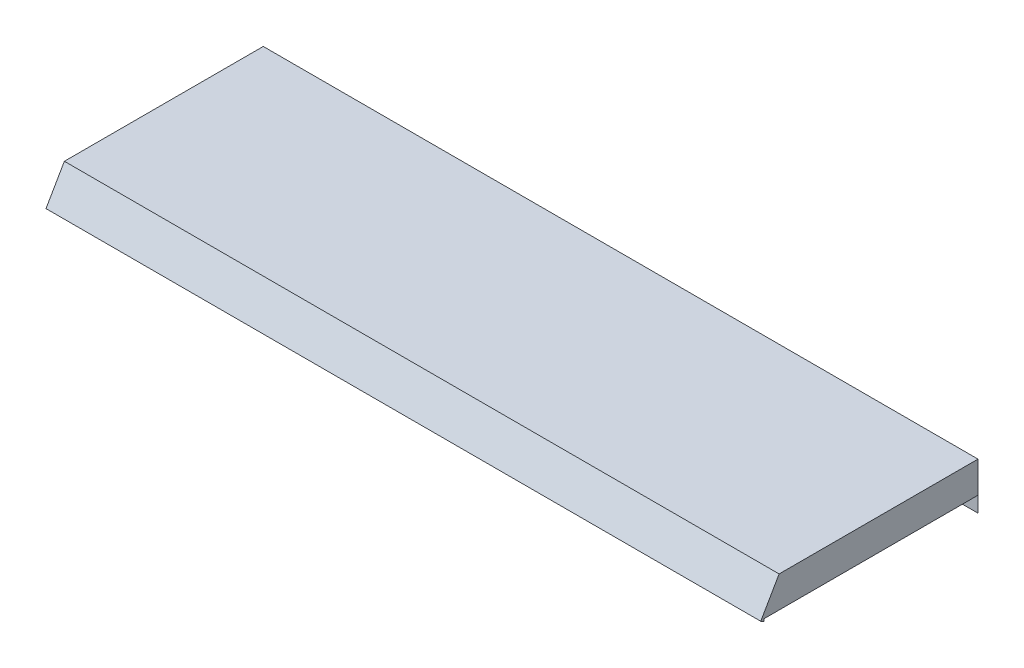
ISO-10303-21;
HEADER;
FILE_DESCRIPTION(('STEP AP214'),'2;1');
FILE_NAME('part.step','',(''),(''),'','','');
FILE_SCHEMA(('AUTOMOTIVE_DESIGN { 1 0 10303 214 1 1 1 1 }'));
ENDSEC;
DATA;
#1=APPLICATION_CONTEXT('core data for automotive mechanical design processes');
#2=APPLICATION_PROTOCOL_DEFINITION('international standard','automotive_design',2000,#1);
#3=PRODUCT_CONTEXT('',#1,'mechanical');
#4=PRODUCT('Part','Part','',(#3));
#5=PRODUCT_RELATED_PRODUCT_CATEGORY('part','',(#4));
#6=PRODUCT_DEFINITION_FORMATION('','',#4);
#7=PRODUCT_DEFINITION_CONTEXT('part definition',#1,'design');
#8=PRODUCT_DEFINITION('design','',#6,#7);
#9=PRODUCT_DEFINITION_SHAPE('','',#8);
#10=(LENGTH_UNIT() NAMED_UNIT(*) SI_UNIT(.MILLI.,.METRE.));
#11=(NAMED_UNIT(*) PLANE_ANGLE_UNIT() SI_UNIT($,.RADIAN.));
#12=(NAMED_UNIT(*) SI_UNIT($,.STERADIAN.) SOLID_ANGLE_UNIT());
#13=UNCERTAINTY_MEASURE_WITH_UNIT(LENGTH_MEASURE(1.E-05),#10,'distance_accuracy_value','');
#14=(GEOMETRIC_REPRESENTATION_CONTEXT(3) GLOBAL_UNCERTAINTY_ASSIGNED_CONTEXT((#13)) GLOBAL_UNIT_ASSIGNED_CONTEXT((#10,
#11,#12)) REPRESENTATION_CONTEXT('',''));
#15=CARTESIAN_POINT('',(0.,0.,0.));
#16=DIRECTION('',(0.,0.,1.));
#17=DIRECTION('',(1.,0.,0.));
#18=AXIS2_PLACEMENT_3D('',#15,#16,#17);
#19=CARTESIAN_POINT('',(191.,0.,0.));
#20=DIRECTION('',(-1.,0.,0.));
#21=DIRECTION('',(0.,0.,1.));
#22=AXIS2_PLACEMENT_3D('',#19,#20,#21);
#23=PLANE('',#22);
#24=DIRECTION('',(0.,0.,1.));
#25=VECTOR('',#24,1.);
#26=CARTESIAN_POINT('',(191.,52.0482754030357,-123.214198806139));
#27=LINE('',#26,#25);
#28=CARTESIAN_POINT('',(191.,52.0482754030357,-114.224498130945));
#29=VERTEX_POINT('',#28);
#30=CARTESIAN_POINT('',(191.,52.0482754030357,-63.0226906539127));
#31=VERTEX_POINT('',#30);
#32=EDGE_CURVE('E108',#29,#31,#27,.T.);
#33=ORIENTED_EDGE('',*,*,#32,.T.);
#34=DIRECTION('',(0.,0.866041614639342,-0.499971920924447));
#35=VECTOR('',#34,1.);
#36=CARTESIAN_POINT('',(191.,-14.2779963984741,-24.7320670166552));
#37=LINE('',#36,#35);
#38=CARTESIAN_POINT('',(191.,43.8581981490481,-58.294501398364));
#39=VERTEX_POINT('',#38);
#40=EDGE_CURVE('E40',#39,#31,#37,.T.);
#41=ORIENTED_EDGE('',*,*,#40,.F.);
#42=DIRECTION('',(0.,-0.499971920924447,-0.866041614639342));
#43=VECTOR('',#42,1.);
#44=CARTESIAN_POINT('',(191.,41.8583104653503,-61.7586678569213));
#45=LINE('',#44,#43);
#46=CARTESIAN_POINT('',(191.,43.3602818059935,-59.1569823810899));
#47=VERTEX_POINT('',#46);
#48=EDGE_CURVE('E116',#39,#47,#45,.T.);
#49=ORIENTED_EDGE('',*,*,#48,.T.);
#50=DIRECTION('',(0.,-0.999999999759779,2.19189973345429E-05));
#51=VECTOR('',#50,1.);
#52=CARTESIAN_POINT('',(191.,43.9996794736459,-59.1569963960457));
#53=LINE('',#52,#51);
#54=CARTESIAN_POINT('',(191.,43.9996794736459,-59.1569963960457));
#55=VERTEX_POINT('',#54);
#56=EDGE_CURVE('E53',#55,#47,#53,.T.);
#57=ORIENTED_EDGE('',*,*,#56,.F.);
#58=DIRECTION('',(0.,2.19189973345185E-05,0.999999999759779));
#59=VECTOR('',#58,1.);
#60=CARTESIAN_POINT('',(191.,43.9984726788402,-114.214022360373));
#61=LINE('',#60,#59);
#62=CARTESIAN_POINT('',(191.,43.9984726788402,-114.214022360373));
#63=VERTEX_POINT('',#62);
#64=EDGE_CURVE('E89',#63,#55,#61,.T.);
#65=ORIENTED_EDGE('',*,*,#64,.F.);
#66=DIRECTION('',(0.,-0.999999999759779,2.19189973345429E-05));
#67=VECTOR('',#66,1.);
#68=CARTESIAN_POINT('',(191.,43.9984726788402,-114.214022360373));
#69=LINE('',#68,#67);
#70=CARTESIAN_POINT('',(191.,39.9984726798011,-114.213934684384));
#71=VERTEX_POINT('',#70);
#72=EDGE_CURVE('E77',#63,#71,#69,.T.);
#73=ORIENTED_EDGE('',*,*,#72,.T.);
#74=DIRECTION('',(0.,2.19189973345429E-05,0.999999999759779));
#75=VECTOR('',#74,1.);
#76=CARTESIAN_POINT('',(191.,40.0009761155134,-0.000876781289065675));
#77=LINE('',#76,#75);
#78=CARTESIAN_POINT('',(191.,39.9984726740802,-114.214195685279));
#79=VERTEX_POINT('',#78);
#80=EDGE_CURVE('E161',#79,#71,#77,.T.);
#81=ORIENTED_EDGE('',*,*,#80,.F.);
#82=DIRECTION('',(0.,-0.999999634497327,0.000854988428673071));
#83=VECTOR('',#82,1.);
#84=CARTESIAN_POINT('',(191.,-0.097622540917072,-114.179913975305));
#85=LINE('',#84,#83);
#86=EDGE_CURVE('E122',#29,#79,#85,.T.);
#87=ORIENTED_EDGE('',*,*,#86,.F.);
#88=EDGE_LOOP('',(#33,#41,#49,#57,#65,#73,#81,#87));
#89=FACE_BOUND('',#88,.T.);
#90=ADVANCED_FACE('F36',(#89),#23,.F.);
#91=CARTESIAN_POINT('',(0.,-0.097622540917072,-114.179913975305));
#92=DIRECTION('',(0.,0.000854988428673071,0.999999634497327));
#93=DIRECTION('',(0.,-0.999999634497327,0.000854988428673071));
#94=AXIS2_PLACEMENT_3D('',#91,#92,#93);
#95=PLANE('',#94);
#96=DIRECTION('',(0.,0.999999634497327,-0.000854988428673071));
#97=VECTOR('',#96,1.);
#98=CARTESIAN_POINT('',(7.,-0.097622540917072,-114.179913975305));
#99=LINE('',#98,#97);
#100=CARTESIAN_POINT('',(7.,39.9984726740519,-114.214196978625));
#101=VERTEX_POINT('',#100);
#102=CARTESIAN_POINT('',(7.,52.0482754030357,-114.224498130945));
#103=VERTEX_POINT('',#102);
#104=EDGE_CURVE('E125',#101,#103,#99,.T.);
#105=ORIENTED_EDGE('',*,*,#104,.T.);
#106=DIRECTION('',(1.,0.,0.));
#107=VECTOR('',#106,1.);
#108=CARTESIAN_POINT('',(0.,52.0482754030357,-114.224498130945));
#109=LINE('',#108,#107);
#110=EDGE_CURVE('E110',#103,#29,#109,.T.);
#111=ORIENTED_EDGE('',*,*,#110,.T.);
#112=ORIENTED_EDGE('',*,*,#86,.T.);
#113=DIRECTION('',(1.,0.,0.));
#114=VECTOR('',#113,1.);
#115=CARTESIAN_POINT('',(0.,39.9984726740802,-114.214195685279));
#116=LINE('',#115,#114);
#117=EDGE_CURVE('E165',#101,#79,#116,.T.);
#118=ORIENTED_EDGE('',*,*,#117,.F.);
#119=EDGE_LOOP('',(#105,#111,#112,#118));
#120=FACE_BOUND('',#119,.T.);
#121=ADVANCED_FACE('F38',(#120),#95,.F.);
#122=CARTESIAN_POINT('',(0.,-14.2779963984741,-24.7320670166552));
#123=DIRECTION('',(0.,-0.499971920924447,-0.866041614639342));
#124=DIRECTION('',(0.,0.866041614639342,-0.499971920924447));
#125=AXIS2_PLACEMENT_3D('',#122,#123,#124);
#126=PLANE('',#125);
#127=DIRECTION('',(-1.,0.,0.));
#128=VECTOR('',#127,1.);
#129=CARTESIAN_POINT('',(0.,52.0482754030357,-63.0226906539127));
#130=LINE('',#129,#128);
#131=CARTESIAN_POINT('',(7.,52.0482754030357,-63.0226906539127));
#132=VERTEX_POINT('',#131);
#133=EDGE_CURVE('E105',#31,#132,#130,.T.);
#134=ORIENTED_EDGE('',*,*,#133,.T.);
#135=DIRECTION('',(0.,0.866041614639342,-0.499971920924447));
#136=VECTOR('',#135,1.);
#137=CARTESIAN_POINT('',(7.,-14.2779963984741,-24.7320670166552));
#138=LINE('',#137,#136);
#139=CARTESIAN_POINT('',(7.00000000000001,43.8581981490481,-58.294501398364));
#140=VERTEX_POINT('',#139);
#141=EDGE_CURVE('E127',#140,#132,#138,.T.);
#142=ORIENTED_EDGE('',*,*,#141,.F.);
#143=DIRECTION('',(1.,0.,0.));
#144=VECTOR('',#143,1.);
#145=CARTESIAN_POINT('',(195.104983797478,43.8581981490481,-58.294501398364));
#146=LINE('',#145,#144);
#147=EDGE_CURVE('E87',#140,#39,#146,.T.);
#148=ORIENTED_EDGE('',*,*,#147,.T.);
#149=ORIENTED_EDGE('',*,*,#40,.T.);
#150=EDGE_LOOP('',(#134,#142,#148,#149));
#151=FACE_BOUND('',#150,.T.);
#152=ADVANCED_FACE('F138',(#151),#126,.F.);
#153=CARTESIAN_POINT('',(7.,0.,0.));
#154=DIRECTION('',(1.,0.,0.));
#155=DIRECTION('',(0.,0.,-1.));
#156=AXIS2_PLACEMENT_3D('',#153,#154,#155);
#157=PLANE('',#156);
#158=DIRECTION('',(0.,0.,-1.));
#159=VECTOR('',#158,1.);
#160=CARTESIAN_POINT('',(7.,52.0482754030357,-123.214198806139));
#161=LINE('',#160,#159);
#162=EDGE_CURVE('E101',#132,#103,#161,.T.);
#163=ORIENTED_EDGE('',*,*,#162,.T.);
#164=ORIENTED_EDGE('',*,*,#104,.F.);
#165=DIRECTION('',(0.,-2.19189973345429E-05,-0.999999999759779));
#166=VECTOR('',#165,1.);
#167=CARTESIAN_POINT('',(7.,40.0009761155134,-0.000876781289065675));
#168=LINE('',#167,#166);
#169=CARTESIAN_POINT('',(7.,39.9984726798011,-114.213934684384));
#170=VERTEX_POINT('',#169);
#171=EDGE_CURVE('E168',#170,#101,#168,.T.);
#172=ORIENTED_EDGE('',*,*,#171,.F.);
#173=DIRECTION('',(0.,-0.999999999759779,2.19189973345429E-05));
#174=VECTOR('',#173,1.);
#175=CARTESIAN_POINT('',(7.,43.9984726788402,-114.214022360373));
#176=LINE('',#175,#174);
#177=CARTESIAN_POINT('',(7.,43.9984726788402,-114.214022360373));
#178=VERTEX_POINT('',#177);
#179=EDGE_CURVE('E61',#178,#170,#176,.T.);
#180=ORIENTED_EDGE('',*,*,#179,.F.);
#181=DIRECTION('',(0.,-2.19189973345185E-05,-0.999999999759779));
#182=VECTOR('',#181,1.);
#183=CARTESIAN_POINT('',(7.,43.9984726788402,-114.214022360373));
#184=LINE('',#183,#182);
#185=CARTESIAN_POINT('',(7.,43.9996794736459,-59.1569963960457));
#186=VERTEX_POINT('',#185);
#187=EDGE_CURVE('E45',#186,#178,#184,.T.);
#188=ORIENTED_EDGE('',*,*,#187,.F.);
#189=DIRECTION('',(0.,-0.999999999759779,2.19189973345429E-05));
#190=VECTOR('',#189,1.);
#191=CARTESIAN_POINT('',(7.,43.9996794736459,-59.1569963960457));
#192=LINE('',#191,#190);
#193=CARTESIAN_POINT('',(7.,43.3602818059935,-59.1569823810899));
#194=VERTEX_POINT('',#193);
#195=EDGE_CURVE('E86',#186,#194,#192,.T.);
#196=ORIENTED_EDGE('',*,*,#195,.T.);
#197=DIRECTION('',(0.,0.499971920924447,0.866041614639342));
#198=VECTOR('',#197,1.);
#199=CARTESIAN_POINT('',(7.00000000000001,41.8583104653503,-61.7586678569213));
#200=LINE('',#199,#198);
#201=EDGE_CURVE('E113',#194,#140,#200,.T.);
#202=ORIENTED_EDGE('',*,*,#201,.T.);
#203=ORIENTED_EDGE('',*,*,#141,.T.);
#204=EDGE_LOOP('',(#163,#164,#172,#180,#188,#196,#202,#203));
#205=FACE_BOUND('',#204,.T.);
#206=ADVANCED_FACE('F152',(#205),#157,.F.);
#207=CARTESIAN_POINT('',(0.,39.9982754030357,-123.214198806139));
#208=DIRECTION('',(0.,-0.999999999759779,2.19189973345429E-05));
#209=DIRECTION('',(0.,-2.19189973345429E-05,-0.999999999759779));
#210=AXIS2_PLACEMENT_3D('',#207,#208,#209);
#211=PLANE('',#210);
#212=DIRECTION('',(1.,0.,0.));
#213=VECTOR('',#212,1.);
#214=CARTESIAN_POINT('',(7.,39.9984726798011,-114.213934684384));
#215=LINE('',#214,#213);
#216=EDGE_CURVE('E11',#170,#71,#215,.T.);
#217=ORIENTED_EDGE('',*,*,#216,.F.);
#218=ORIENTED_EDGE('',*,*,#171,.T.);
#219=ORIENTED_EDGE('',*,*,#117,.T.);
#220=ORIENTED_EDGE('',*,*,#80,.T.);
#221=EDGE_LOOP('',(#217,#218,#219,#220));
#222=FACE_BOUND('',#221,.T.);
#223=ADVANCED_FACE('F170',(#222),#211,.T.);
#224=CARTESIAN_POINT('',(7.,43.9996794736459,-59.1569963960457));
#225=DIRECTION('',(0.,2.19189973345429E-05,0.999999999759779));
#226=DIRECTION('',(0.,-0.999999999759779,2.19189973345429E-05));
#227=AXIS2_PLACEMENT_3D('',#224,#225,#226);
#228=PLANE('',#227);
#229=DIRECTION('',(1.,0.,0.));
#230=VECTOR('',#229,1.);
#231=CARTESIAN_POINT('',(7.,43.3602818059935,-59.1569823810899));
#232=LINE('',#231,#230);
#233=EDGE_CURVE('E104',#194,#47,#232,.T.);
#234=ORIENTED_EDGE('',*,*,#233,.F.);
#235=ORIENTED_EDGE('',*,*,#195,.F.);
#236=DIRECTION('',(-1.,0.,0.));
#237=VECTOR('',#236,1.);
#238=CARTESIAN_POINT('',(7.,43.9996794736459,-59.1569963960457));
#239=LINE('',#238,#237);
#240=EDGE_CURVE('E93',#55,#186,#239,.T.);
#241=ORIENTED_EDGE('',*,*,#240,.F.);
#242=ORIENTED_EDGE('',*,*,#56,.T.);
#243=EDGE_LOOP('',(#234,#235,#241,#242));
#244=FACE_BOUND('',#243,.T.);
#245=ADVANCED_FACE('F177',(#244),#228,.F.);
#246=CARTESIAN_POINT('',(195.104983797478,41.8583104653503,-61.7586678569213));
#247=DIRECTION('',(0.,-0.866041614639342,0.499971920924447));
#248=DIRECTION('',(0.,-0.499971920924447,-0.866041614639342));
#249=AXIS2_PLACEMENT_3D('',#246,#247,#248);
#250=PLANE('',#249);
#251=ORIENTED_EDGE('',*,*,#201,.F.);
#252=ORIENTED_EDGE('',*,*,#233,.T.);
#253=ORIENTED_EDGE('',*,*,#48,.F.);
#254=ORIENTED_EDGE('',*,*,#147,.F.);
#255=EDGE_LOOP('',(#251,#252,#253,#254));
#256=FACE_BOUND('',#255,.T.);
#257=ADVANCED_FACE('F182',(#256),#250,.T.);
#258=CARTESIAN_POINT('',(7.,43.9984726788402,-114.214022360373));
#259=DIRECTION('',(0.,-2.19189973345429E-05,-0.999999999759779));
#260=DIRECTION('',(0.,0.999999999759779,-2.19189973345429E-05));
#261=AXIS2_PLACEMENT_3D('',#258,#259,#260);
#262=PLANE('',#261);
#263=ORIENTED_EDGE('',*,*,#216,.T.);
#264=ORIENTED_EDGE('',*,*,#72,.F.);
#265=DIRECTION('',(1.,0.,0.));
#266=VECTOR('',#265,1.);
#267=CARTESIAN_POINT('',(7.,43.9984726788402,-114.214022360373));
#268=LINE('',#267,#266);
#269=EDGE_CURVE('E81',#178,#63,#268,.T.);
#270=ORIENTED_EDGE('',*,*,#269,.F.);
#271=ORIENTED_EDGE('',*,*,#179,.T.);
#272=EDGE_LOOP('',(#263,#264,#270,#271));
#273=FACE_BOUND('',#272,.T.);
#274=ADVANCED_FACE('F79',(#273),#262,.F.);
#275=CARTESIAN_POINT('',(0.,44.0009761145526,-0.00096445727840287));
#276=DIRECTION('',(0.,0.999999999759779,-2.19189973345185E-05));
#277=DIRECTION('',(0.,2.19189973345185E-05,0.999999999759779));
#278=AXIS2_PLACEMENT_3D('',#275,#276,#277);
#279=PLANE('',#278);
#280=ORIENTED_EDGE('',*,*,#187,.T.);
#281=ORIENTED_EDGE('',*,*,#269,.T.);
#282=ORIENTED_EDGE('',*,*,#64,.T.);
#283=ORIENTED_EDGE('',*,*,#240,.T.);
#284=EDGE_LOOP('',(#280,#281,#282,#283));
#285=FACE_BOUND('',#284,.T.);
#286=ADVANCED_FACE('F95',(#285),#279,.F.);
#287=CARTESIAN_POINT('',(0.,52.0482754030357,-123.214198806139));
#288=DIRECTION('',(0.,1.,0.));
#289=DIRECTION('',(0.,0.,1.));
#290=AXIS2_PLACEMENT_3D('',#287,#288,#289);
#291=PLANE('',#290);
#292=ORIENTED_EDGE('',*,*,#162,.F.);
#293=ORIENTED_EDGE('',*,*,#133,.F.);
#294=ORIENTED_EDGE('',*,*,#32,.F.);
#295=ORIENTED_EDGE('',*,*,#110,.F.);
#296=EDGE_LOOP('',(#292,#293,#294,#295));
#297=FACE_BOUND('',#296,.T.);
#298=ADVANCED_FACE('F145',(#297),#291,.T.);
#299=CLOSED_SHELL('',(#90,#121,#152,#206,#223,#245,#257,#274,#286,#298));
#300=MANIFOLD_SOLID_BREP('B2',#299);
#301=ADVANCED_BREP_SHAPE_REPRESENTATION('',(#18,#300),#14);
#302=SHAPE_DEFINITION_REPRESENTATION(#9,#301);
ENDSEC;
END-ISO-10303-21;
